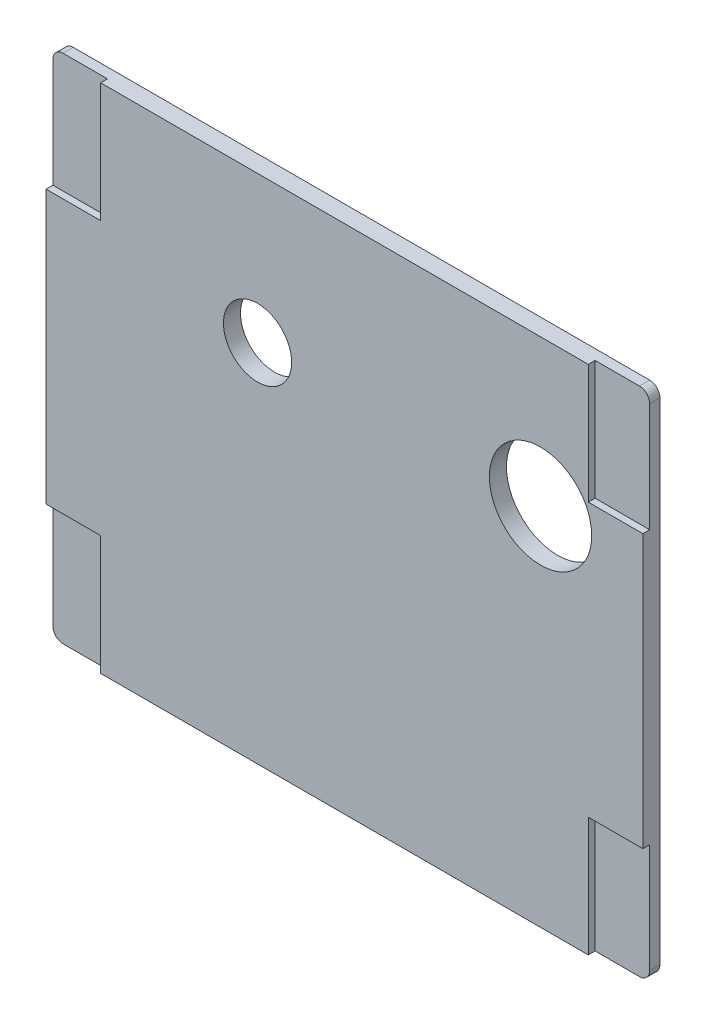
ISO-10303-21;
HEADER;
FILE_DESCRIPTION(('STEP AP214'),'2;1');
FILE_NAME('part.step','',(''),(''),'','','');
FILE_SCHEMA(('AUTOMOTIVE_DESIGN { 1 0 10303 214 1 1 1 1 }'));
ENDSEC;
DATA;
#1=APPLICATION_CONTEXT('core data for automotive mechanical design processes');
#2=APPLICATION_PROTOCOL_DEFINITION('international standard','automotive_design',2000,#1);
#3=PRODUCT_CONTEXT('',#1,'mechanical');
#4=PRODUCT('Part','Part','',(#3));
#5=PRODUCT_RELATED_PRODUCT_CATEGORY('part','',(#4));
#6=PRODUCT_DEFINITION_FORMATION('','',#4);
#7=PRODUCT_DEFINITION_CONTEXT('part definition',#1,'design');
#8=PRODUCT_DEFINITION('design','',#6,#7);
#9=PRODUCT_DEFINITION_SHAPE('','',#8);
#10=(LENGTH_UNIT() NAMED_UNIT(*) SI_UNIT(.MILLI.,.METRE.));
#11=(NAMED_UNIT(*) PLANE_ANGLE_UNIT() SI_UNIT($,.RADIAN.));
#12=(NAMED_UNIT(*) SI_UNIT($,.STERADIAN.) SOLID_ANGLE_UNIT());
#13=UNCERTAINTY_MEASURE_WITH_UNIT(LENGTH_MEASURE(1.E-05),#10,'distance_accuracy_value','');
#14=(GEOMETRIC_REPRESENTATION_CONTEXT(3) GLOBAL_UNCERTAINTY_ASSIGNED_CONTEXT((#13)) GLOBAL_UNIT_ASSIGNED_CONTEXT((#10,
#11,#12)) REPRESENTATION_CONTEXT('',''));
#15=CARTESIAN_POINT('',(0.,0.,0.));
#16=DIRECTION('',(0.,0.,1.));
#17=DIRECTION('',(1.,0.,0.));
#18=AXIS2_PLACEMENT_3D('',#15,#16,#17);
#19=CARTESIAN_POINT('',(0.,0.,5.));
#20=DIRECTION('',(-1.,0.,0.));
#21=DIRECTION('',(0.,-1.,0.));
#22=AXIS2_PLACEMENT_3D('',#19,#20,#21);
#23=PLANE('',#22);
#24=DIRECTION('',(0.,1.,0.));
#25=VECTOR('',#24,1.);
#26=CARTESIAN_POINT('',(0.,-150.,3.));
#27=LINE('',#26,#25);
#28=CARTESIAN_POINT('',(0.,-147.,3.));
#29=VERTEX_POINT('',#28);
#30=CARTESIAN_POINT('',(0.,-115.,3.));
#31=VERTEX_POINT('',#30);
#32=EDGE_CURVE('E204',#29,#31,#27,.T.);
#33=ORIENTED_EDGE('',*,*,#32,.F.);
#34=DIRECTION('',(0.,0.,-1.));
#35=VECTOR('',#34,1.);
#36=CARTESIAN_POINT('',(0.,-147.,5.));
#37=LINE('',#36,#35);
#38=CARTESIAN_POINT('',(0.,-147.,0.));
#39=VERTEX_POINT('',#38);
#40=EDGE_CURVE('E331',#29,#39,#37,.T.);
#41=ORIENTED_EDGE('',*,*,#40,.T.);
#42=DIRECTION('',(0.,1.,0.));
#43=VECTOR('',#42,1.);
#44=CARTESIAN_POINT('',(0.,0.,0.));
#45=LINE('',#44,#43);
#46=CARTESIAN_POINT('',(0.,-3.,0.));
#47=VERTEX_POINT('',#46);
#48=EDGE_CURVE('E280',#39,#47,#45,.T.);
#49=ORIENTED_EDGE('',*,*,#48,.T.);
#50=DIRECTION('',(0.,0.,-1.));
#51=VECTOR('',#50,1.);
#52=CARTESIAN_POINT('',(0.,-3.,5.));
#53=LINE('',#52,#51);
#54=CARTESIAN_POINT('',(0.,-3.,3.));
#55=VERTEX_POINT('',#54);
#56=EDGE_CURVE('E48',#47,#55,#53,.F.);
#57=ORIENTED_EDGE('',*,*,#56,.T.);
#58=DIRECTION('',(0.,1.,0.));
#59=VECTOR('',#58,1.);
#60=CARTESIAN_POINT('',(0.,0.,3.));
#61=LINE('',#60,#59);
#62=CARTESIAN_POINT('',(0.,-35.,3.));
#63=VERTEX_POINT('',#62);
#64=EDGE_CURVE('E182',#63,#55,#61,.T.);
#65=ORIENTED_EDGE('',*,*,#64,.F.);
#66=DIRECTION('',(0.,0.,1.));
#67=VECTOR('',#66,1.);
#68=CARTESIAN_POINT('',(0.,-35.,3.));
#69=LINE('',#68,#67);
#70=CARTESIAN_POINT('',(0.,-35.,5.));
#71=VERTEX_POINT('',#70);
#72=EDGE_CURVE('E199',#63,#71,#69,.T.);
#73=ORIENTED_EDGE('',*,*,#72,.T.);
#74=DIRECTION('',(0.,1.,0.));
#75=VECTOR('',#74,1.);
#76=CARTESIAN_POINT('',(0.,0.,5.));
#77=LINE('',#76,#75);
#78=CARTESIAN_POINT('',(0.,-115.,5.));
#79=VERTEX_POINT('',#78);
#80=EDGE_CURVE('E285',#79,#71,#77,.T.);
#81=ORIENTED_EDGE('',*,*,#80,.F.);
#82=DIRECTION('',(0.,0.,1.));
#83=VECTOR('',#82,1.);
#84=CARTESIAN_POINT('',(0.,-115.,3.));
#85=LINE('',#84,#83);
#86=EDGE_CURVE('E215',#31,#79,#85,.T.);
#87=ORIENTED_EDGE('',*,*,#86,.F.);
#88=EDGE_LOOP('',(#33,#41,#49,#57,#65,#73,#81,#87));
#89=FACE_BOUND('',#88,.T.);
#90=ADVANCED_FACE('F33',(#89),#23,.F.);
#91=CARTESIAN_POINT('',(0.,0.,5.));
#92=DIRECTION('',(0.,-1.,0.));
#93=DIRECTION('',(1.,0.,0.));
#94=AXIS2_PLACEMENT_3D('',#91,#92,#93);
#95=PLANE('',#94);
#96=DIRECTION('',(-1.,0.,0.));
#97=VECTOR('',#96,1.);
#98=CARTESIAN_POINT('',(0.,0.,0.));
#99=LINE('',#98,#97);
#100=CARTESIAN_POINT('',(-3.,0.,0.));
#101=VERTEX_POINT('',#100);
#102=CARTESIAN_POINT('',(-172.,0.,0.));
#103=VERTEX_POINT('',#102);
#104=EDGE_CURVE('E298',#101,#103,#99,.T.);
#105=ORIENTED_EDGE('',*,*,#104,.T.);
#106=DIRECTION('',(0.,0.,-1.));
#107=VECTOR('',#106,1.);
#108=CARTESIAN_POINT('',(-172.,0.,5.));
#109=LINE('',#108,#107);
#110=CARTESIAN_POINT('',(-172.,0.,3.));
#111=VERTEX_POINT('',#110);
#112=EDGE_CURVE('E319',#103,#111,#109,.F.);
#113=ORIENTED_EDGE('',*,*,#112,.T.);
#114=DIRECTION('',(-1.,0.,0.));
#115=VECTOR('',#114,1.);
#116=CARTESIAN_POINT('',(-175.,0.,3.));
#117=LINE('',#116,#115);
#118=CARTESIAN_POINT('',(-159.,0.,3.));
#119=VERTEX_POINT('',#118);
#120=EDGE_CURVE('E259',#119,#111,#117,.T.);
#121=ORIENTED_EDGE('',*,*,#120,.F.);
#122=DIRECTION('',(0.,0.,1.));
#123=VECTOR('',#122,1.);
#124=CARTESIAN_POINT('',(-159.,0.,3.));
#125=LINE('',#124,#123);
#126=CARTESIAN_POINT('',(-159.,0.,5.));
#127=VERTEX_POINT('',#126);
#128=EDGE_CURVE('E267',#119,#127,#125,.T.);
#129=ORIENTED_EDGE('',*,*,#128,.T.);
#130=DIRECTION('',(-1.,0.,0.));
#131=VECTOR('',#130,1.);
#132=CARTESIAN_POINT('',(0.,0.,5.));
#133=LINE('',#132,#131);
#134=CARTESIAN_POINT('',(-16.,0.,5.));
#135=VERTEX_POINT('',#134);
#136=EDGE_CURVE('E197',#135,#127,#133,.T.);
#137=ORIENTED_EDGE('',*,*,#136,.F.);
#138=DIRECTION('',(0.,0.,1.));
#139=VECTOR('',#138,1.);
#140=CARTESIAN_POINT('',(-16.,0.,3.));
#141=LINE('',#140,#139);
#142=CARTESIAN_POINT('',(-16.,0.,3.));
#143=VERTEX_POINT('',#142);
#144=EDGE_CURVE('E187',#143,#135,#141,.T.);
#145=ORIENTED_EDGE('',*,*,#144,.F.);
#146=DIRECTION('',(-1.,0.,0.));
#147=VECTOR('',#146,1.);
#148=CARTESIAN_POINT('',(0.,0.,3.));
#149=LINE('',#148,#147);
#150=CARTESIAN_POINT('',(-3.,0.,3.));
#151=VERTEX_POINT('',#150);
#152=EDGE_CURVE('E171',#151,#143,#149,.T.);
#153=ORIENTED_EDGE('',*,*,#152,.F.);
#154=DIRECTION('',(0.,0.,-1.));
#155=VECTOR('',#154,1.);
#156=CARTESIAN_POINT('',(-3.,0.,5.));
#157=LINE('',#156,#155);
#158=EDGE_CURVE('E317',#151,#101,#157,.T.);
#159=ORIENTED_EDGE('',*,*,#158,.T.);
#160=EDGE_LOOP('',(#105,#113,#121,#129,#137,#145,#153,#159));
#161=FACE_BOUND('',#160,.T.);
#162=ADVANCED_FACE('F194',(#161),#95,.F.);
#163=CARTESIAN_POINT('',(-175.,0.,5.));
#164=DIRECTION('',(1.,0.,0.));
#165=DIRECTION('',(0.,0.,-1.));
#166=AXIS2_PLACEMENT_3D('',#163,#164,#165);
#167=PLANE('',#166);
#168=DIRECTION('',(0.,-1.,0.));
#169=VECTOR('',#168,1.);
#170=CARTESIAN_POINT('',(-175.,0.,3.));
#171=LINE('',#170,#169);
#172=CARTESIAN_POINT('',(-175.,-3.00000000000002,3.));
#173=VERTEX_POINT('',#172);
#174=CARTESIAN_POINT('',(-175.,-35.,3.));
#175=VERTEX_POINT('',#174);
#176=EDGE_CURVE('E250',#173,#175,#171,.T.);
#177=ORIENTED_EDGE('',*,*,#176,.F.);
#178=DIRECTION('',(0.,0.,-1.));
#179=VECTOR('',#178,1.);
#180=CARTESIAN_POINT('',(-175.,-3.00000000000002,5.));
#181=LINE('',#180,#179);
#182=CARTESIAN_POINT('',(-175.,-3.00000000000002,0.));
#183=VERTEX_POINT('',#182);
#184=EDGE_CURVE('E306',#173,#183,#181,.T.);
#185=ORIENTED_EDGE('',*,*,#184,.T.);
#186=DIRECTION('',(0.,-1.,0.));
#187=VECTOR('',#186,1.);
#188=CARTESIAN_POINT('',(-175.,0.,0.));
#189=LINE('',#188,#187);
#190=CARTESIAN_POINT('',(-175.,-147.,0.));
#191=VERTEX_POINT('',#190);
#192=EDGE_CURVE('E300',#183,#191,#189,.T.);
#193=ORIENTED_EDGE('',*,*,#192,.T.);
#194=DIRECTION('',(0.,0.,-1.));
#195=VECTOR('',#194,1.);
#196=CARTESIAN_POINT('',(-175.,-147.,5.));
#197=LINE('',#196,#195);
#198=CARTESIAN_POINT('',(-175.,-147.,3.));
#199=VERTEX_POINT('',#198);
#200=EDGE_CURVE('E296',#191,#199,#197,.F.);
#201=ORIENTED_EDGE('',*,*,#200,.T.);
#202=DIRECTION('',(0.,-1.,0.));
#203=VECTOR('',#202,1.);
#204=CARTESIAN_POINT('',(-175.,-150.,3.));
#205=LINE('',#204,#203);
#206=CARTESIAN_POINT('',(-175.,-115.,3.));
#207=VERTEX_POINT('',#206);
#208=EDGE_CURVE('E228',#207,#199,#205,.T.);
#209=ORIENTED_EDGE('',*,*,#208,.F.);
#210=DIRECTION('',(0.,0.,1.));
#211=VECTOR('',#210,1.);
#212=CARTESIAN_POINT('',(-175.,-115.,3.));
#213=LINE('',#212,#211);
#214=CARTESIAN_POINT('',(-175.,-115.,5.));
#215=VERTEX_POINT('',#214);
#216=EDGE_CURVE('E219',#207,#215,#213,.T.);
#217=ORIENTED_EDGE('',*,*,#216,.T.);
#218=DIRECTION('',(0.,-1.,0.));
#219=VECTOR('',#218,1.);
#220=CARTESIAN_POINT('',(-175.,0.,5.));
#221=LINE('',#220,#219);
#222=CARTESIAN_POINT('',(-175.,-35.,5.));
#223=VERTEX_POINT('',#222);
#224=EDGE_CURVE('E290',#223,#215,#221,.T.);
#225=ORIENTED_EDGE('',*,*,#224,.F.);
#226=DIRECTION('',(0.,0.,1.));
#227=VECTOR('',#226,1.);
#228=CARTESIAN_POINT('',(-175.,-35.,3.));
#229=LINE('',#228,#227);
#230=EDGE_CURVE('E262',#175,#223,#229,.T.);
#231=ORIENTED_EDGE('',*,*,#230,.F.);
#232=EDGE_LOOP('',(#177,#185,#193,#201,#209,#217,#225,#231));
#233=FACE_BOUND('',#232,.T.);
#234=ADVANCED_FACE('F355',(#233),#167,.F.);
#235=CARTESIAN_POINT('',(0.,-150.,5.));
#236=DIRECTION('',(0.,1.,0.));
#237=DIRECTION('',(-1.,0.,0.));
#238=AXIS2_PLACEMENT_3D('',#235,#236,#237);
#239=PLANE('',#238);
#240=DIRECTION('',(1.,0.,0.));
#241=VECTOR('',#240,1.);
#242=CARTESIAN_POINT('',(-175.,-150.,3.));
#243=LINE('',#242,#241);
#244=CARTESIAN_POINT('',(-172.,-150.,3.));
#245=VERTEX_POINT('',#244);
#246=CARTESIAN_POINT('',(-159.,-150.,3.));
#247=VERTEX_POINT('',#246);
#248=EDGE_CURVE('E231',#245,#247,#243,.T.);
#249=ORIENTED_EDGE('',*,*,#248,.F.);
#250=DIRECTION('',(0.,0.,-1.));
#251=VECTOR('',#250,1.);
#252=CARTESIAN_POINT('',(-172.,-150.,5.));
#253=LINE('',#252,#251);
#254=CARTESIAN_POINT('',(-172.,-150.,0.));
#255=VERTEX_POINT('',#254);
#256=EDGE_CURVE('E325',#245,#255,#253,.T.);
#257=ORIENTED_EDGE('',*,*,#256,.T.);
#258=DIRECTION('',(1.,0.,0.));
#259=VECTOR('',#258,1.);
#260=CARTESIAN_POINT('',(0.,-150.,0.));
#261=LINE('',#260,#259);
#262=CARTESIAN_POINT('',(-2.99999999999998,-150.,0.));
#263=VERTEX_POINT('',#262);
#264=EDGE_CURVE('E288',#255,#263,#261,.T.);
#265=ORIENTED_EDGE('',*,*,#264,.T.);
#266=DIRECTION('',(0.,0.,-1.));
#267=VECTOR('',#266,1.);
#268=CARTESIAN_POINT('',(-2.99999999999998,-150.,5.));
#269=LINE('',#268,#267);
#270=CARTESIAN_POINT('',(-2.99999999999998,-150.,3.));
#271=VERTEX_POINT('',#270);
#272=EDGE_CURVE('E323',#263,#271,#269,.F.);
#273=ORIENTED_EDGE('',*,*,#272,.T.);
#274=DIRECTION('',(1.,0.,0.));
#275=VECTOR('',#274,1.);
#276=CARTESIAN_POINT('',(0.,-150.,3.));
#277=LINE('',#276,#275);
#278=CARTESIAN_POINT('',(-16.,-150.,3.));
#279=VERTEX_POINT('',#278);
#280=EDGE_CURVE('E213',#279,#271,#277,.T.);
#281=ORIENTED_EDGE('',*,*,#280,.F.);
#282=DIRECTION('',(0.,0.,1.));
#283=VECTOR('',#282,1.);
#284=CARTESIAN_POINT('',(-16.,-150.,3.));
#285=LINE('',#284,#283);
#286=CARTESIAN_POINT('',(-16.,-150.,5.));
#287=VERTEX_POINT('',#286);
#288=EDGE_CURVE('E221',#279,#287,#285,.T.);
#289=ORIENTED_EDGE('',*,*,#288,.T.);
#290=DIRECTION('',(1.,0.,0.));
#291=VECTOR('',#290,1.);
#292=CARTESIAN_POINT('',(0.,-150.,5.));
#293=LINE('',#292,#291);
#294=CARTESIAN_POINT('',(-159.,-150.,5.));
#295=VERTEX_POINT('',#294);
#296=EDGE_CURVE('E293',#295,#287,#293,.T.);
#297=ORIENTED_EDGE('',*,*,#296,.F.);
#298=DIRECTION('',(0.,0.,1.));
#299=VECTOR('',#298,1.);
#300=CARTESIAN_POINT('',(-159.,-150.,3.));
#301=LINE('',#300,#299);
#302=EDGE_CURVE('E240',#247,#295,#301,.T.);
#303=ORIENTED_EDGE('',*,*,#302,.F.);
#304=EDGE_LOOP('',(#249,#257,#265,#273,#281,#289,#297,#303));
#305=FACE_BOUND('',#304,.T.);
#306=ADVANCED_FACE('F402',(#305),#239,.F.);
#307=CARTESIAN_POINT('',(0.,0.,5.));
#308=DIRECTION('',(0.,0.,-1.));
#309=DIRECTION('',(-1.,0.,0.));
#310=AXIS2_PLACEMENT_3D('',#307,#308,#309);
#311=PLANE('',#310);
#312=CARTESIAN_POINT('',(-30.,-43.,5.));
#313=DIRECTION('',(0.,0.,1.));
#314=DIRECTION('',(1.,0.,0.));
#315=AXIS2_PLACEMENT_3D('',#312,#313,#314);
#316=CIRCLE('',#315,15.);
#317=CARTESIAN_POINT('',(-15.,-43.,5.));
#318=VERTEX_POINT('',#317);
#319=EDGE_CURVE('E273',#318,#318,#316,.T.);
#320=ORIENTED_EDGE('',*,*,#319,.F.);
#321=EDGE_LOOP('',(#320));
#322=FACE_BOUND('',#321,.T.);
#323=CARTESIAN_POINT('',(-113.,-43.,5.));
#324=DIRECTION('',(0.,0.,1.));
#325=DIRECTION('',(1.,0.,0.));
#326=AXIS2_PLACEMENT_3D('',#323,#324,#325);
#327=CIRCLE('',#326,9.99999999999999);
#328=CARTESIAN_POINT('',(-103.,-43.,5.));
#329=VERTEX_POINT('',#328);
#330=EDGE_CURVE('E269',#329,#329,#327,.T.);
#331=ORIENTED_EDGE('',*,*,#330,.F.);
#332=EDGE_LOOP('',(#331));
#333=FACE_BOUND('',#332,.T.);
#334=ORIENTED_EDGE('',*,*,#224,.T.);
#335=DIRECTION('',(-1.,0.,0.));
#336=VECTOR('',#335,1.);
#337=CARTESIAN_POINT('',(-175.,-115.,5.));
#338=LINE('',#337,#336);
#339=CARTESIAN_POINT('',(-159.,-115.,5.));
#340=VERTEX_POINT('',#339);
#341=EDGE_CURVE('E232',#340,#215,#338,.T.);
#342=ORIENTED_EDGE('',*,*,#341,.F.);
#343=DIRECTION('',(0.,1.,0.));
#344=VECTOR('',#343,1.);
#345=CARTESIAN_POINT('',(-159.,-150.,5.));
#346=LINE('',#345,#344);
#347=EDGE_CURVE('E241',#295,#340,#346,.T.);
#348=ORIENTED_EDGE('',*,*,#347,.F.);
#349=ORIENTED_EDGE('',*,*,#296,.T.);
#350=DIRECTION('',(0.,-1.,0.));
#351=VECTOR('',#350,1.);
#352=CARTESIAN_POINT('',(-16.,-150.,5.));
#353=LINE('',#352,#351);
#354=CARTESIAN_POINT('',(-16.,-115.,5.));
#355=VERTEX_POINT('',#354);
#356=EDGE_CURVE('E207',#355,#287,#353,.T.);
#357=ORIENTED_EDGE('',*,*,#356,.F.);
#358=DIRECTION('',(-1.,0.,0.));
#359=VECTOR('',#358,1.);
#360=CARTESIAN_POINT('',(0.,-115.,5.));
#361=LINE('',#360,#359);
#362=EDGE_CURVE('E216',#79,#355,#361,.T.);
#363=ORIENTED_EDGE('',*,*,#362,.F.);
#364=ORIENTED_EDGE('',*,*,#80,.T.);
#365=DIRECTION('',(1.,0.,0.));
#366=VECTOR('',#365,1.);
#367=CARTESIAN_POINT('',(0.,-35.,5.));
#368=LINE('',#367,#366);
#369=CARTESIAN_POINT('',(-16.,-35.,5.));
#370=VERTEX_POINT('',#369);
#371=EDGE_CURVE('E457',#370,#71,#368,.T.);
#372=ORIENTED_EDGE('',*,*,#371,.F.);
#373=DIRECTION('',(0.,-1.,0.));
#374=VECTOR('',#373,1.);
#375=CARTESIAN_POINT('',(-16.,0.,5.));
#376=LINE('',#375,#374);
#377=EDGE_CURVE('E224',#135,#370,#376,.T.);
#378=ORIENTED_EDGE('',*,*,#377,.F.);
#379=ORIENTED_EDGE('',*,*,#136,.T.);
#380=DIRECTION('',(0.,1.,0.));
#381=VECTOR('',#380,1.);
#382=CARTESIAN_POINT('',(-159.,0.,5.));
#383=LINE('',#382,#381);
#384=CARTESIAN_POINT('',(-159.,-35.,5.));
#385=VERTEX_POINT('',#384);
#386=EDGE_CURVE('E253',#385,#127,#383,.T.);
#387=ORIENTED_EDGE('',*,*,#386,.F.);
#388=DIRECTION('',(1.,0.,0.));
#389=VECTOR('',#388,1.);
#390=CARTESIAN_POINT('',(-175.,-35.,5.));
#391=LINE('',#390,#389);
#392=EDGE_CURVE('E263',#223,#385,#391,.T.);
#393=ORIENTED_EDGE('',*,*,#392,.F.);
#394=EDGE_LOOP('',(#334,#342,#348,#349,#357,#363,#364,#372,#378,#379,#387,#393));
#395=FACE_BOUND('',#394,.T.);
#396=ADVANCED_FACE('F362',(#322,#333,#395),#311,.F.);
#397=CARTESIAN_POINT('',(0.,0.,0.));
#398=DIRECTION('',(0.,0.,-1.));
#399=DIRECTION('',(-1.,0.,0.));
#400=AXIS2_PLACEMENT_3D('',#397,#398,#399);
#401=PLANE('',#400);
#402=CARTESIAN_POINT('',(-30.,-43.,0.));
#403=DIRECTION('',(0.,0.,-1.));
#404=DIRECTION('',(-1.,0.,0.));
#405=AXIS2_PLACEMENT_3D('',#402,#403,#404);
#406=CIRCLE('',#405,15.);
#407=CARTESIAN_POINT('',(-45.,-43.,0.));
#408=VERTEX_POINT('',#407);
#409=EDGE_CURVE('E276',#408,#408,#406,.F.);
#410=ORIENTED_EDGE('',*,*,#409,.T.);
#411=EDGE_LOOP('',(#410));
#412=FACE_BOUND('',#411,.T.);
#413=CARTESIAN_POINT('',(-113.,-43.,0.));
#414=DIRECTION('',(0.,0.,-1.));
#415=DIRECTION('',(-1.,0.,0.));
#416=AXIS2_PLACEMENT_3D('',#413,#414,#415);
#417=CIRCLE('',#416,9.99999999999999);
#418=CARTESIAN_POINT('',(-123.,-43.,0.));
#419=VERTEX_POINT('',#418);
#420=EDGE_CURVE('E277',#419,#419,#417,.F.);
#421=ORIENTED_EDGE('',*,*,#420,.T.);
#422=EDGE_LOOP('',(#421));
#423=FACE_BOUND('',#422,.T.);
#424=ORIENTED_EDGE('',*,*,#192,.F.);
#425=CARTESIAN_POINT('',(-172.,-3.00000000000002,0.));
#426=DIRECTION('',(0.,0.,-1.));
#427=DIRECTION('',(-1.,0.,0.));
#428=AXIS2_PLACEMENT_3D('',#425,#426,#427);
#429=CIRCLE('',#428,3.);
#430=EDGE_CURVE('E315',#183,#103,#429,.T.);
#431=ORIENTED_EDGE('',*,*,#430,.T.);
#432=ORIENTED_EDGE('',*,*,#104,.F.);
#433=CARTESIAN_POINT('',(-3.,-3.,0.));
#434=DIRECTION('',(0.,0.,-1.));
#435=DIRECTION('',(-1.,0.,0.));
#436=AXIS2_PLACEMENT_3D('',#433,#434,#435);
#437=CIRCLE('',#436,3.);
#438=EDGE_CURVE('E309',#101,#47,#437,.T.);
#439=ORIENTED_EDGE('',*,*,#438,.T.);
#440=ORIENTED_EDGE('',*,*,#48,.F.);
#441=CARTESIAN_POINT('',(-2.99999999999998,-147.,0.));
#442=DIRECTION('',(0.,0.,-1.));
#443=DIRECTION('',(-1.,0.,0.));
#444=AXIS2_PLACEMENT_3D('',#441,#442,#443);
#445=CIRCLE('',#444,3.);
#446=EDGE_CURVE('E311',#39,#263,#445,.T.);
#447=ORIENTED_EDGE('',*,*,#446,.T.);
#448=ORIENTED_EDGE('',*,*,#264,.F.);
#449=CARTESIAN_POINT('',(-172.,-147.,0.));
#450=DIRECTION('',(0.,0.,-1.));
#451=DIRECTION('',(-1.,0.,0.));
#452=AXIS2_PLACEMENT_3D('',#449,#450,#451);
#453=CIRCLE('',#452,3.);
#454=EDGE_CURVE('E313',#255,#191,#453,.T.);
#455=ORIENTED_EDGE('',*,*,#454,.T.);
#456=EDGE_LOOP('',(#424,#431,#432,#439,#440,#447,#448,#455));
#457=FACE_BOUND('',#456,.T.);
#458=ADVANCED_FACE('F339',(#412,#423,#457),#401,.T.);
#459=CARTESIAN_POINT('',(-113.,-43.,-42.4264068711929));
#460=DIRECTION('',(0.,0.,1.));
#461=DIRECTION('',(1.,0.,0.));
#462=AXIS2_PLACEMENT_3D('',#459,#460,#461);
#463=CYLINDRICAL_SURFACE('',#462,9.99999999999999);
#464=ORIENTED_EDGE('',*,*,#330,.T.);
#465=EDGE_LOOP('',(#464));
#466=FACE_BOUND('',#465,.T.);
#467=ORIENTED_EDGE('',*,*,#420,.F.);
#468=EDGE_LOOP('',(#467));
#469=FACE_BOUND('',#468,.T.);
#470=ADVANCED_FACE('F375',(#466,#469),#463,.F.);
#471=CARTESIAN_POINT('',(-30.,-43.,-42.4264068711929));
#472=DIRECTION('',(0.,0.,1.));
#473=DIRECTION('',(1.,0.,0.));
#474=AXIS2_PLACEMENT_3D('',#471,#472,#473);
#475=CYLINDRICAL_SURFACE('',#474,15.);
#476=ORIENTED_EDGE('',*,*,#319,.T.);
#477=EDGE_LOOP('',(#476));
#478=FACE_BOUND('',#477,.T.);
#479=ORIENTED_EDGE('',*,*,#409,.F.);
#480=EDGE_LOOP('',(#479));
#481=FACE_BOUND('',#480,.T.);
#482=ADVANCED_FACE('F368',(#478,#481),#475,.F.);
#483=CARTESIAN_POINT('',(-159.,0.,3.));
#484=DIRECTION('',(1.,0.,0.));
#485=DIRECTION('',(0.,0.,-1.));
#486=AXIS2_PLACEMENT_3D('',#483,#484,#485);
#487=PLANE('',#486);
#488=ORIENTED_EDGE('',*,*,#386,.T.);
#489=ORIENTED_EDGE('',*,*,#128,.F.);
#490=DIRECTION('',(0.,1.,0.));
#491=VECTOR('',#490,1.);
#492=CARTESIAN_POINT('',(-159.,0.,3.));
#493=LINE('',#492,#491);
#494=CARTESIAN_POINT('',(-159.,-35.,3.));
#495=VERTEX_POINT('',#494);
#496=EDGE_CURVE('E256',#495,#119,#493,.T.);
#497=ORIENTED_EDGE('',*,*,#496,.F.);
#498=DIRECTION('',(0.,0.,1.));
#499=VECTOR('',#498,1.);
#500=CARTESIAN_POINT('',(-159.,-35.,3.));
#501=LINE('',#500,#499);
#502=EDGE_CURVE('E270',#495,#385,#501,.T.);
#503=ORIENTED_EDGE('',*,*,#502,.T.);
#504=EDGE_LOOP('',(#488,#489,#497,#503));
#505=FACE_BOUND('',#504,.T.);
#506=ADVANCED_FACE('F365',(#505),#487,.F.);
#507=CARTESIAN_POINT('',(-175.,-35.,3.));
#508=DIRECTION('',(0.,-1.,0.));
#509=DIRECTION('',(0.,0.,-1.));
#510=AXIS2_PLACEMENT_3D('',#507,#508,#509);
#511=PLANE('',#510);
#512=ORIENTED_EDGE('',*,*,#392,.T.);
#513=ORIENTED_EDGE('',*,*,#502,.F.);
#514=DIRECTION('',(1.,0.,0.));
#515=VECTOR('',#514,1.);
#516=CARTESIAN_POINT('',(-175.,-35.,3.));
#517=LINE('',#516,#515);
#518=EDGE_CURVE('E252',#175,#495,#517,.T.);
#519=ORIENTED_EDGE('',*,*,#518,.F.);
#520=ORIENTED_EDGE('',*,*,#230,.T.);
#521=EDGE_LOOP('',(#512,#513,#519,#520));
#522=FACE_BOUND('',#521,.T.);
#523=ADVANCED_FACE('F359',(#522),#511,.F.);
#524=CARTESIAN_POINT('',(0.,0.,3.));
#525=DIRECTION('',(0.,0.,1.));
#526=DIRECTION('',(1.,0.,0.));
#527=AXIS2_PLACEMENT_3D('',#524,#525,#526);
#528=PLANE('',#527);
#529=ORIENTED_EDGE('',*,*,#120,.T.);
#530=CARTESIAN_POINT('',(-172.,-3.00000000000002,3.));
#531=DIRECTION('',(0.,0.,1.));
#532=DIRECTION('',(1.,0.,0.));
#533=AXIS2_PLACEMENT_3D('',#530,#531,#532);
#534=CIRCLE('',#533,3.);
#535=EDGE_CURVE('E321',#111,#173,#534,.T.);
#536=ORIENTED_EDGE('',*,*,#535,.T.);
#537=ORIENTED_EDGE('',*,*,#176,.T.);
#538=ORIENTED_EDGE('',*,*,#518,.T.);
#539=ORIENTED_EDGE('',*,*,#496,.T.);
#540=EDGE_LOOP('',(#529,#536,#537,#538,#539));
#541=FACE_BOUND('',#540,.T.);
#542=ADVANCED_FACE('F351',(#541),#528,.T.);
#543=CARTESIAN_POINT('',(0.,-35.,3.));
#544=DIRECTION('',(0.,-1.,0.));
#545=DIRECTION('',(0.,0.,-1.));
#546=AXIS2_PLACEMENT_3D('',#543,#544,#545);
#547=PLANE('',#546);
#548=ORIENTED_EDGE('',*,*,#371,.T.);
#549=ORIENTED_EDGE('',*,*,#72,.F.);
#550=DIRECTION('',(1.,0.,0.));
#551=VECTOR('',#550,1.);
#552=CARTESIAN_POINT('',(0.,-35.,3.));
#553=LINE('',#552,#551);
#554=CARTESIAN_POINT('',(-16.,-35.,3.));
#555=VERTEX_POINT('',#554);
#556=EDGE_CURVE('E190',#555,#63,#553,.T.);
#557=ORIENTED_EDGE('',*,*,#556,.F.);
#558=DIRECTION('',(0.,0.,1.));
#559=VECTOR('',#558,1.);
#560=CARTESIAN_POINT('',(-16.,-35.,3.));
#561=LINE('',#560,#559);
#562=EDGE_CURVE('E189',#555,#370,#561,.T.);
#563=ORIENTED_EDGE('',*,*,#562,.T.);
#564=EDGE_LOOP('',(#548,#549,#557,#563));
#565=FACE_BOUND('',#564,.T.);
#566=ADVANCED_FACE('F436',(#565),#547,.F.);
#567=CARTESIAN_POINT('',(-16.,0.,3.));
#568=DIRECTION('',(-1.,0.,0.));
#569=DIRECTION('',(0.,-1.,0.));
#570=AXIS2_PLACEMENT_3D('',#567,#568,#569);
#571=PLANE('',#570);
#572=ORIENTED_EDGE('',*,*,#377,.T.);
#573=ORIENTED_EDGE('',*,*,#562,.F.);
#574=DIRECTION('',(0.,-1.,0.));
#575=VECTOR('',#574,1.);
#576=CARTESIAN_POINT('',(-16.,0.,3.));
#577=LINE('',#576,#575);
#578=EDGE_CURVE('E175',#143,#555,#577,.T.);
#579=ORIENTED_EDGE('',*,*,#578,.F.);
#580=ORIENTED_EDGE('',*,*,#144,.T.);
#581=EDGE_LOOP('',(#572,#573,#579,#580));
#582=FACE_BOUND('',#581,.T.);
#583=ADVANCED_FACE('F186',(#582),#571,.F.);
#584=CARTESIAN_POINT('',(0.,0.,3.));
#585=DIRECTION('',(0.,0.,-1.));
#586=DIRECTION('',(-1.,0.,0.));
#587=AXIS2_PLACEMENT_3D('',#584,#585,#586);
#588=PLANE('',#587);
#589=ORIENTED_EDGE('',*,*,#64,.T.);
#590=CARTESIAN_POINT('',(-3.,-3.,3.));
#591=DIRECTION('',(0.,0.,-1.));
#592=DIRECTION('',(-1.,0.,0.));
#593=AXIS2_PLACEMENT_3D('',#590,#591,#592);
#594=CIRCLE('',#593,3.);
#595=EDGE_CURVE('E11',#55,#151,#594,.F.);
#596=ORIENTED_EDGE('',*,*,#595,.T.);
#597=ORIENTED_EDGE('',*,*,#152,.T.);
#598=ORIENTED_EDGE('',*,*,#578,.T.);
#599=ORIENTED_EDGE('',*,*,#556,.T.);
#600=EDGE_LOOP('',(#589,#596,#597,#598,#599));
#601=FACE_BOUND('',#600,.T.);
#602=ADVANCED_FACE('F173',(#601),#588,.F.);
#603=CARTESIAN_POINT('',(-16.,-150.,3.));
#604=DIRECTION('',(-1.,0.,0.));
#605=DIRECTION('',(0.,0.,1.));
#606=AXIS2_PLACEMENT_3D('',#603,#604,#605);
#607=PLANE('',#606);
#608=ORIENTED_EDGE('',*,*,#356,.T.);
#609=ORIENTED_EDGE('',*,*,#288,.F.);
#610=DIRECTION('',(0.,-1.,0.));
#611=VECTOR('',#610,1.);
#612=CARTESIAN_POINT('',(-16.,-150.,3.));
#613=LINE('',#612,#611);
#614=CARTESIAN_POINT('',(-16.,-115.,3.));
#615=VERTEX_POINT('',#614);
#616=EDGE_CURVE('E210',#615,#279,#613,.T.);
#617=ORIENTED_EDGE('',*,*,#616,.F.);
#618=DIRECTION('',(0.,0.,1.));
#619=VECTOR('',#618,1.);
#620=CARTESIAN_POINT('',(-16.,-115.,3.));
#621=LINE('',#620,#619);
#622=EDGE_CURVE('E225',#615,#355,#621,.T.);
#623=ORIENTED_EDGE('',*,*,#622,.T.);
#624=EDGE_LOOP('',(#608,#609,#617,#623));
#625=FACE_BOUND('',#624,.T.);
#626=ADVANCED_FACE('F407',(#625),#607,.F.);
#627=CARTESIAN_POINT('',(0.,-115.,3.));
#628=DIRECTION('',(0.,1.,0.));
#629=DIRECTION('',(0.,0.,1.));
#630=AXIS2_PLACEMENT_3D('',#627,#628,#629);
#631=PLANE('',#630);
#632=ORIENTED_EDGE('',*,*,#362,.T.);
#633=ORIENTED_EDGE('',*,*,#622,.F.);
#634=DIRECTION('',(-1.,0.,0.));
#635=VECTOR('',#634,1.);
#636=CARTESIAN_POINT('',(0.,-115.,3.));
#637=LINE('',#636,#635);
#638=EDGE_CURVE('E206',#31,#615,#637,.T.);
#639=ORIENTED_EDGE('',*,*,#638,.F.);
#640=ORIENTED_EDGE('',*,*,#86,.T.);
#641=EDGE_LOOP('',(#632,#633,#639,#640));
#642=FACE_BOUND('',#641,.T.);
#643=ADVANCED_FACE('F431',(#642),#631,.F.);
#644=CARTESIAN_POINT('',(0.,0.,3.));
#645=DIRECTION('',(0.,0.,1.));
#646=DIRECTION('',(1.,0.,0.));
#647=AXIS2_PLACEMENT_3D('',#644,#645,#646);
#648=PLANE('',#647);
#649=ORIENTED_EDGE('',*,*,#280,.T.);
#650=CARTESIAN_POINT('',(-2.99999999999998,-147.,3.));
#651=DIRECTION('',(0.,0.,1.));
#652=DIRECTION('',(1.,0.,0.));
#653=AXIS2_PLACEMENT_3D('',#650,#651,#652);
#654=CIRCLE('',#653,3.);
#655=EDGE_CURVE('E41',#271,#29,#654,.T.);
#656=ORIENTED_EDGE('',*,*,#655,.T.);
#657=ORIENTED_EDGE('',*,*,#32,.T.);
#658=ORIENTED_EDGE('',*,*,#638,.T.);
#659=ORIENTED_EDGE('',*,*,#616,.T.);
#660=EDGE_LOOP('',(#649,#656,#657,#658,#659));
#661=FACE_BOUND('',#660,.T.);
#662=ADVANCED_FACE('F403',(#661),#648,.T.);
#663=CARTESIAN_POINT('',(-175.,-115.,3.));
#664=DIRECTION('',(0.,1.,0.));
#665=DIRECTION('',(0.,0.,1.));
#666=AXIS2_PLACEMENT_3D('',#663,#664,#665);
#667=PLANE('',#666);
#668=ORIENTED_EDGE('',*,*,#341,.T.);
#669=ORIENTED_EDGE('',*,*,#216,.F.);
#670=DIRECTION('',(-1.,0.,0.));
#671=VECTOR('',#670,1.);
#672=CARTESIAN_POINT('',(-175.,-115.,3.));
#673=LINE('',#672,#671);
#674=CARTESIAN_POINT('',(-159.,-115.,3.));
#675=VERTEX_POINT('',#674);
#676=EDGE_CURVE('E237',#675,#207,#673,.T.);
#677=ORIENTED_EDGE('',*,*,#676,.F.);
#678=DIRECTION('',(0.,0.,1.));
#679=VECTOR('',#678,1.);
#680=CARTESIAN_POINT('',(-159.,-115.,3.));
#681=LINE('',#680,#679);
#682=EDGE_CURVE('E247',#675,#340,#681,.T.);
#683=ORIENTED_EDGE('',*,*,#682,.T.);
#684=EDGE_LOOP('',(#668,#669,#677,#683));
#685=FACE_BOUND('',#684,.T.);
#686=ADVANCED_FACE('F423',(#685),#667,.F.);
#687=CARTESIAN_POINT('',(-159.,-150.,3.));
#688=DIRECTION('',(1.,0.,0.));
#689=DIRECTION('',(0.,0.,-1.));
#690=AXIS2_PLACEMENT_3D('',#687,#688,#689);
#691=PLANE('',#690);
#692=ORIENTED_EDGE('',*,*,#347,.T.);
#693=ORIENTED_EDGE('',*,*,#682,.F.);
#694=DIRECTION('',(0.,1.,0.));
#695=VECTOR('',#694,1.);
#696=CARTESIAN_POINT('',(-159.,-150.,3.));
#697=LINE('',#696,#695);
#698=EDGE_CURVE('E234',#247,#675,#697,.T.);
#699=ORIENTED_EDGE('',*,*,#698,.F.);
#700=ORIENTED_EDGE('',*,*,#302,.T.);
#701=EDGE_LOOP('',(#692,#693,#699,#700));
#702=FACE_BOUND('',#701,.T.);
#703=ADVANCED_FACE('F414',(#702),#691,.F.);
#704=CARTESIAN_POINT('',(0.,0.,3.));
#705=DIRECTION('',(0.,0.,-1.));
#706=DIRECTION('',(-1.,0.,0.));
#707=AXIS2_PLACEMENT_3D('',#704,#705,#706);
#708=PLANE('',#707);
#709=ORIENTED_EDGE('',*,*,#208,.T.);
#710=CARTESIAN_POINT('',(-172.,-147.,3.));
#711=DIRECTION('',(0.,0.,-1.));
#712=DIRECTION('',(-1.,0.,0.));
#713=AXIS2_PLACEMENT_3D('',#710,#711,#712);
#714=CIRCLE('',#713,3.);
#715=EDGE_CURVE('E328',#199,#245,#714,.F.);
#716=ORIENTED_EDGE('',*,*,#715,.T.);
#717=ORIENTED_EDGE('',*,*,#248,.T.);
#718=ORIENTED_EDGE('',*,*,#698,.T.);
#719=ORIENTED_EDGE('',*,*,#676,.T.);
#720=EDGE_LOOP('',(#709,#716,#717,#718,#719));
#721=FACE_BOUND('',#720,.T.);
#722=ADVANCED_FACE('F390',(#721),#708,.F.);
#723=CARTESIAN_POINT('',(-172.,-3.00000000000002,5.));
#724=DIRECTION('',(0.,0.,-1.));
#725=DIRECTION('',(-1.,0.,0.));
#726=AXIS2_PLACEMENT_3D('',#723,#724,#725);
#727=CYLINDRICAL_SURFACE('',#726,3.);
#728=ORIENTED_EDGE('',*,*,#535,.F.);
#729=ORIENTED_EDGE('',*,*,#112,.F.);
#730=ORIENTED_EDGE('',*,*,#430,.F.);
#731=ORIENTED_EDGE('',*,*,#184,.F.);
#732=EDGE_LOOP('',(#728,#729,#730,#731));
#733=FACE_BOUND('',#732,.T.);
#734=ADVANCED_FACE('F347',(#733),#727,.T.);
#735=CARTESIAN_POINT('',(-172.,-147.,5.));
#736=DIRECTION('',(0.,0.,-1.));
#737=DIRECTION('',(-1.,0.,0.));
#738=AXIS2_PLACEMENT_3D('',#735,#736,#737);
#739=CYLINDRICAL_SURFACE('',#738,3.);
#740=ORIENTED_EDGE('',*,*,#715,.F.);
#741=ORIENTED_EDGE('',*,*,#200,.F.);
#742=ORIENTED_EDGE('',*,*,#454,.F.);
#743=ORIENTED_EDGE('',*,*,#256,.F.);
#744=EDGE_LOOP('',(#740,#741,#742,#743));
#745=FACE_BOUND('',#744,.T.);
#746=ADVANCED_FACE('F389',(#745),#739,.T.);
#747=CARTESIAN_POINT('',(-2.99999999999998,-147.,5.));
#748=DIRECTION('',(0.,0.,-1.));
#749=DIRECTION('',(-1.,0.,0.));
#750=AXIS2_PLACEMENT_3D('',#747,#748,#749);
#751=CYLINDRICAL_SURFACE('',#750,3.);
#752=ORIENTED_EDGE('',*,*,#655,.F.);
#753=ORIENTED_EDGE('',*,*,#272,.F.);
#754=ORIENTED_EDGE('',*,*,#446,.F.);
#755=ORIENTED_EDGE('',*,*,#40,.F.);
#756=EDGE_LOOP('',(#752,#753,#754,#755));
#757=FACE_BOUND('',#756,.T.);
#758=ADVANCED_FACE('F392',(#757),#751,.T.);
#759=CARTESIAN_POINT('',(-3.,-3.,5.));
#760=DIRECTION('',(0.,0.,-1.));
#761=DIRECTION('',(-1.,0.,0.));
#762=AXIS2_PLACEMENT_3D('',#759,#760,#761);
#763=CYLINDRICAL_SURFACE('',#762,3.);
#764=ORIENTED_EDGE('',*,*,#595,.F.);
#765=ORIENTED_EDGE('',*,*,#56,.F.);
#766=ORIENTED_EDGE('',*,*,#438,.F.);
#767=ORIENTED_EDGE('',*,*,#158,.F.);
#768=EDGE_LOOP('',(#764,#765,#766,#767));
#769=FACE_BOUND('',#768,.T.);
#770=ADVANCED_FACE('F35',(#769),#763,.T.);
#771=CLOSED_SHELL('',(#90,#162,#234,#306,#396,#458,#470,#482,#506,#523,#542,#566,#583,#602,#626,
#643,#662,#686,#703,#722,#734,#746,#758,#770));
#772=MANIFOLD_SOLID_BREP('B2',#771);
#773=ADVANCED_BREP_SHAPE_REPRESENTATION('',(#18,#772),#14);
#774=SHAPE_DEFINITION_REPRESENTATION(#9,#773);
ENDSEC;
END-ISO-10303-21;
